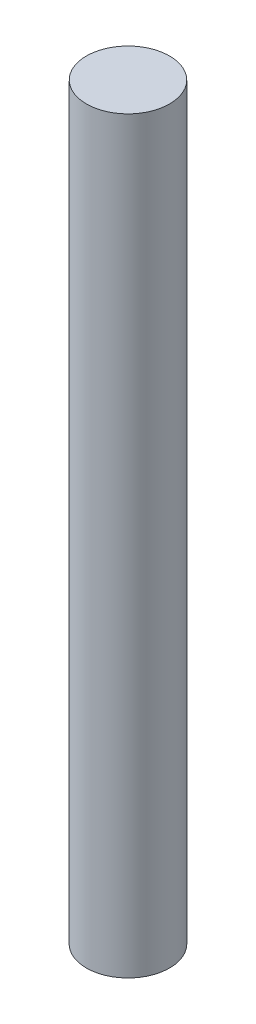
ISO-10303-21;
HEADER;
FILE_DESCRIPTION(('STEP AP214'),'2;1');
FILE_NAME('part.step','',(''),(''),'','','');
FILE_SCHEMA(('AUTOMOTIVE_DESIGN { 1 0 10303 214 1 1 1 1 }'));
ENDSEC;
DATA;
#1=APPLICATION_CONTEXT('core data for automotive mechanical design processes');
#2=APPLICATION_PROTOCOL_DEFINITION('international standard','automotive_design',2000,#1);
#3=PRODUCT_CONTEXT('',#1,'mechanical');
#4=PRODUCT('Part','Part','',(#3));
#5=PRODUCT_RELATED_PRODUCT_CATEGORY('part','',(#4));
#6=PRODUCT_DEFINITION_FORMATION('','',#4);
#7=PRODUCT_DEFINITION_CONTEXT('part definition',#1,'design');
#8=PRODUCT_DEFINITION('design','',#6,#7);
#9=PRODUCT_DEFINITION_SHAPE('','',#8);
#10=(LENGTH_UNIT() NAMED_UNIT(*) SI_UNIT(.MILLI.,.METRE.));
#11=(NAMED_UNIT(*) PLANE_ANGLE_UNIT() SI_UNIT($,.RADIAN.));
#12=(NAMED_UNIT(*) SI_UNIT($,.STERADIAN.) SOLID_ANGLE_UNIT());
#13=UNCERTAINTY_MEASURE_WITH_UNIT(LENGTH_MEASURE(1.E-05),#10,'distance_accuracy_value','');
#14=(GEOMETRIC_REPRESENTATION_CONTEXT(3) GLOBAL_UNCERTAINTY_ASSIGNED_CONTEXT((#13)) GLOBAL_UNIT_ASSIGNED_CONTEXT((#10,
#11,#12)) REPRESENTATION_CONTEXT('',''));
#15=CARTESIAN_POINT('',(0.,0.,0.));
#16=DIRECTION('',(0.,0.,1.));
#17=DIRECTION('',(1.,0.,0.));
#18=AXIS2_PLACEMENT_3D('',#15,#16,#17);
#19=CARTESIAN_POINT('',(0.,540.,0.));
#20=DIRECTION('',(0.,-1.,0.));
#21=DIRECTION('',(0.,0.,-1.));
#22=AXIS2_PLACEMENT_3D('',#19,#20,#21);
#23=CYLINDRICAL_SURFACE('',#22,30.);
#24=CARTESIAN_POINT('',(0.,540.,0.));
#25=DIRECTION('',(0.,1.,0.));
#26=DIRECTION('',(0.,0.,1.));
#27=AXIS2_PLACEMENT_3D('',#24,#25,#26);
#28=CIRCLE('',#27,30.);
#29=CARTESIAN_POINT('',(0.,540.,30.));
#30=VERTEX_POINT('',#29);
#31=EDGE_CURVE('E10',#30,#30,#28,.T.);
#32=ORIENTED_EDGE('',*,*,#31,.F.);
#33=EDGE_LOOP('',(#32));
#34=FACE_BOUND('',#33,.T.);
#35=CARTESIAN_POINT('',(0.,0.,0.));
#36=DIRECTION('',(0.,1.,0.));
#37=DIRECTION('',(0.,0.,1.));
#38=AXIS2_PLACEMENT_3D('',#35,#36,#37);
#39=CIRCLE('',#38,30.);
#40=CARTESIAN_POINT('',(0.,0.,30.));
#41=VERTEX_POINT('',#40);
#42=EDGE_CURVE('E36',#41,#41,#39,.T.);
#43=ORIENTED_EDGE('',*,*,#42,.T.);
#44=EDGE_LOOP('',(#43));
#45=FACE_BOUND('',#44,.T.);
#46=ADVANCED_FACE('F33',(#34,#45),#23,.T.);
#47=CARTESIAN_POINT('',(0.,540.,0.));
#48=DIRECTION('',(0.,1.,0.));
#49=DIRECTION('',(0.,0.,1.));
#50=AXIS2_PLACEMENT_3D('',#47,#48,#49);
#51=PLANE('',#50);
#52=ORIENTED_EDGE('',*,*,#31,.T.);
#53=EDGE_LOOP('',(#52));
#54=FACE_BOUND('',#53,.T.);
#55=ADVANCED_FACE('F48',(#54),#51,.T.);
#56=CARTESIAN_POINT('',(0.,0.,0.));
#57=DIRECTION('',(0.,1.,0.));
#58=DIRECTION('',(0.,0.,1.));
#59=AXIS2_PLACEMENT_3D('',#56,#57,#58);
#60=PLANE('',#59);
#61=ORIENTED_EDGE('',*,*,#42,.F.);
#62=EDGE_LOOP('',(#61));
#63=FACE_BOUND('',#62,.T.);
#64=ADVANCED_FACE('F46',(#63),#60,.F.);
#65=CLOSED_SHELL('',(#46,#55,#64));
#66=MANIFOLD_SOLID_BREP('B2',#65);
#67=ADVANCED_BREP_SHAPE_REPRESENTATION('',(#18,#66),#14);
#68=SHAPE_DEFINITION_REPRESENTATION(#9,#67);
ENDSEC;
END-ISO-10303-21;
